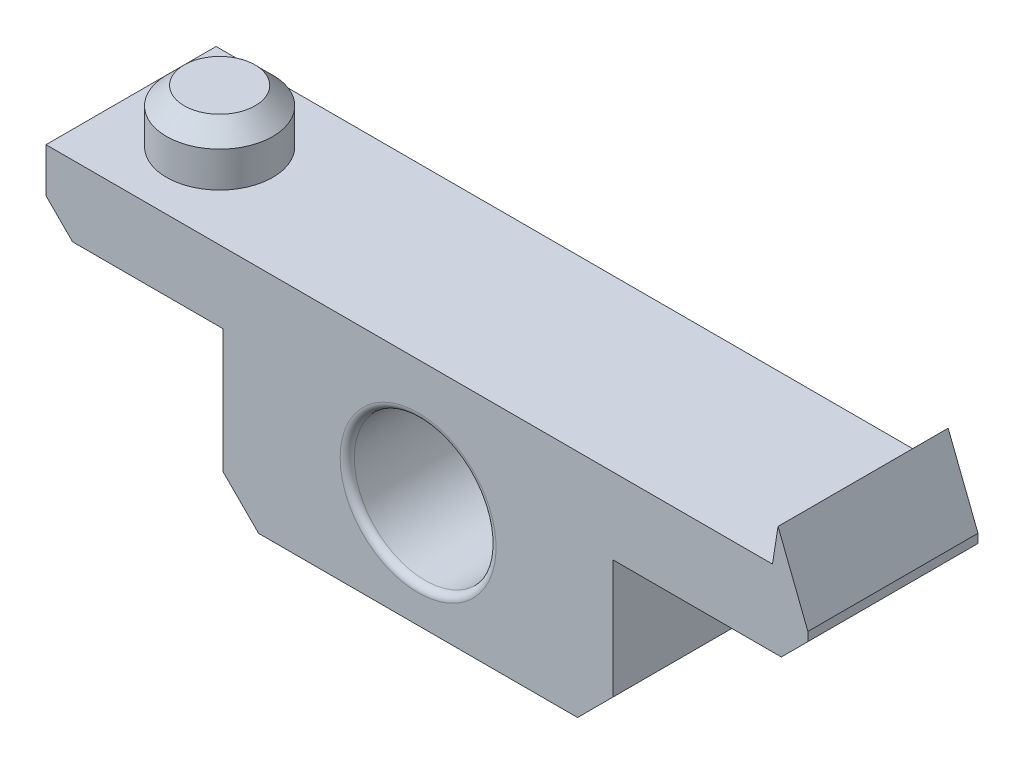
ISO-10303-21;
HEADER;
FILE_DESCRIPTION(('STEP AP214'),'2;1');
FILE_NAME('part.step','',(''),(''),'','','');
FILE_SCHEMA(('AUTOMOTIVE_DESIGN { 1 0 10303 214 1 1 1 1 }'));
ENDSEC;
DATA;
#1=APPLICATION_CONTEXT('core data for automotive mechanical design processes');
#2=APPLICATION_PROTOCOL_DEFINITION('international standard','automotive_design',2000,#1);
#3=PRODUCT_CONTEXT('',#1,'mechanical');
#4=PRODUCT('Part','Part','',(#3));
#5=PRODUCT_RELATED_PRODUCT_CATEGORY('part','',(#4));
#6=PRODUCT_DEFINITION_FORMATION('','',#4);
#7=PRODUCT_DEFINITION_CONTEXT('part definition',#1,'design');
#8=PRODUCT_DEFINITION('design','',#6,#7);
#9=PRODUCT_DEFINITION_SHAPE('','',#8);
#10=(LENGTH_UNIT() NAMED_UNIT(*) SI_UNIT(.MILLI.,.METRE.));
#11=(NAMED_UNIT(*) PLANE_ANGLE_UNIT() SI_UNIT($,.RADIAN.));
#12=(NAMED_UNIT(*) SI_UNIT($,.STERADIAN.) SOLID_ANGLE_UNIT());
#13=UNCERTAINTY_MEASURE_WITH_UNIT(LENGTH_MEASURE(1.E-05),#10,'distance_accuracy_value','');
#14=(GEOMETRIC_REPRESENTATION_CONTEXT(3) GLOBAL_UNCERTAINTY_ASSIGNED_CONTEXT((#13)) GLOBAL_UNIT_ASSIGNED_CONTEXT((#10,
#11,#12)) REPRESENTATION_CONTEXT('',''));
#15=CARTESIAN_POINT('',(0.,0.,0.));
#16=DIRECTION('',(0.,0.,1.));
#17=DIRECTION('',(1.,0.,0.));
#18=AXIS2_PLACEMENT_3D('',#15,#16,#17);
#19=CARTESIAN_POINT('',(0.,-2.,4.8));
#20=DIRECTION('',(1.,0.,0.));
#21=DIRECTION('',(0.,0.,-1.));
#22=AXIS2_PLACEMENT_3D('',#19,#20,#21);
#23=PLANE('',#22);
#24=DIRECTION('',(0.,-1.,0.));
#25=VECTOR('',#24,1.);
#26=CARTESIAN_POINT('',(0.,-2.,0.));
#27=LINE('',#26,#25);
#28=CARTESIAN_POINT('',(0.,0.,0.));
#29=VERTEX_POINT('',#28);
#30=CARTESIAN_POINT('',(0.,-1.24999999999999,0.));
#31=VERTEX_POINT('',#30);
#32=EDGE_CURVE('E182',#29,#31,#27,.T.);
#33=ORIENTED_EDGE('',*,*,#32,.T.);
#34=DIRECTION('',(0.,0.,1.));
#35=VECTOR('',#34,1.);
#36=CARTESIAN_POINT('',(0.,-1.24999999999999,4.8));
#37=LINE('',#36,#35);
#38=CARTESIAN_POINT('',(0.,-1.24999999999999,4.8));
#39=VERTEX_POINT('',#38);
#40=EDGE_CURVE('E238',#31,#39,#37,.T.);
#41=ORIENTED_EDGE('',*,*,#40,.T.);
#42=DIRECTION('',(0.,-1.,0.));
#43=VECTOR('',#42,1.);
#44=CARTESIAN_POINT('',(0.,-2.,4.8));
#45=LINE('',#44,#43);
#46=CARTESIAN_POINT('',(0.,0.,4.8));
#47=VERTEX_POINT('',#46);
#48=EDGE_CURVE('E147',#47,#39,#45,.T.);
#49=ORIENTED_EDGE('',*,*,#48,.F.);
#50=DIRECTION('',(0.,0.,-1.));
#51=VECTOR('',#50,1.);
#52=CARTESIAN_POINT('',(0.,0.,4.8));
#53=LINE('',#52,#51);
#54=EDGE_CURVE('E181',#47,#29,#53,.T.);
#55=ORIENTED_EDGE('',*,*,#54,.T.);
#56=EDGE_LOOP('',(#33,#41,#49,#55));
#57=FACE_BOUND('',#56,.T.);
#58=ADVANCED_FACE('F33',(#57),#23,.F.);
#59=CARTESIAN_POINT('',(5.,-2.,4.8));
#60=DIRECTION('',(0.,1.,0.));
#61=DIRECTION('',(-1.,0.,0.));
#62=AXIS2_PLACEMENT_3D('',#59,#60,#61);
#63=PLANE('',#62);
#64=DIRECTION('',(1.,0.,0.));
#65=VECTOR('',#64,1.);
#66=CARTESIAN_POINT('',(5.,-2.,4.8));
#67=LINE('',#66,#65);
#68=CARTESIAN_POINT('',(0.750000000000004,-2.,4.8));
#69=VERTEX_POINT('',#68);
#70=CARTESIAN_POINT('',(5.,-2.,4.8));
#71=VERTEX_POINT('',#70);
#72=EDGE_CURVE('E135',#69,#71,#67,.T.);
#73=ORIENTED_EDGE('',*,*,#72,.F.);
#74=DIRECTION('',(0.,0.,-1.));
#75=VECTOR('',#74,1.);
#76=CARTESIAN_POINT('',(0.750000000000004,-2.,4.8));
#77=LINE('',#76,#75);
#78=CARTESIAN_POINT('',(0.750000000000004,-2.,0.));
#79=VERTEX_POINT('',#78);
#80=EDGE_CURVE('E232',#69,#79,#77,.T.);
#81=ORIENTED_EDGE('',*,*,#80,.T.);
#82=DIRECTION('',(1.,0.,0.));
#83=VECTOR('',#82,1.);
#84=CARTESIAN_POINT('',(5.,-2.,0.));
#85=LINE('',#84,#83);
#86=CARTESIAN_POINT('',(5.,-2.,0.));
#87=VERTEX_POINT('',#86);
#88=EDGE_CURVE('E153',#79,#87,#85,.T.);
#89=ORIENTED_EDGE('',*,*,#88,.T.);
#90=DIRECTION('',(0.,0.,-1.));
#91=VECTOR('',#90,1.);
#92=CARTESIAN_POINT('',(5.,-2.,4.8));
#93=LINE('',#92,#91);
#94=EDGE_CURVE('E150',#71,#87,#93,.T.);
#95=ORIENTED_EDGE('',*,*,#94,.F.);
#96=EDGE_LOOP('',(#73,#81,#89,#95));
#97=FACE_BOUND('',#96,.T.);
#98=ADVANCED_FACE('F151',(#97),#63,.F.);
#99=CARTESIAN_POINT('',(5.,-6.5,4.8));
#100=DIRECTION('',(1.,0.,0.));
#101=DIRECTION('',(0.,0.,-1.));
#102=AXIS2_PLACEMENT_3D('',#99,#100,#101);
#103=PLANE('',#102);
#104=DIRECTION('',(0.,-1.,0.));
#105=VECTOR('',#104,1.);
#106=CARTESIAN_POINT('',(5.,-6.5,0.));
#107=LINE('',#106,#105);
#108=CARTESIAN_POINT('',(5.,-5.49999999999999,0.));
#109=VERTEX_POINT('',#108);
#110=EDGE_CURVE('E186',#87,#109,#107,.T.);
#111=ORIENTED_EDGE('',*,*,#110,.T.);
#112=DIRECTION('',(0.,0.,1.));
#113=VECTOR('',#112,1.);
#114=CARTESIAN_POINT('',(5.,-5.49999999999999,4.8));
#115=LINE('',#114,#113);
#116=CARTESIAN_POINT('',(5.,-5.49999999999999,4.8));
#117=VERTEX_POINT('',#116);
#118=EDGE_CURVE('E162',#109,#117,#115,.T.);
#119=ORIENTED_EDGE('',*,*,#118,.T.);
#120=DIRECTION('',(0.,-1.,0.));
#121=VECTOR('',#120,1.);
#122=CARTESIAN_POINT('',(5.,-6.5,4.8));
#123=LINE('',#122,#121);
#124=EDGE_CURVE('E140',#71,#117,#123,.T.);
#125=ORIENTED_EDGE('',*,*,#124,.F.);
#126=ORIENTED_EDGE('',*,*,#94,.T.);
#127=EDGE_LOOP('',(#111,#119,#125,#126));
#128=FACE_BOUND('',#127,.T.);
#129=ADVANCED_FACE('F160',(#128),#103,.F.);
#130=CARTESIAN_POINT('',(16.,-6.5,4.8));
#131=DIRECTION('',(0.,1.,0.));
#132=DIRECTION('',(-1.,0.,0.));
#133=AXIS2_PLACEMENT_3D('',#130,#131,#132);
#134=PLANE('',#133);
#135=DIRECTION('',(1.,0.,0.));
#136=VECTOR('',#135,1.);
#137=CARTESIAN_POINT('',(16.,-6.5,0.));
#138=LINE('',#137,#136);
#139=CARTESIAN_POINT('',(5.99999999999999,-6.5,0.));
#140=VERTEX_POINT('',#139);
#141=CARTESIAN_POINT('',(15.,-6.5,0.));
#142=VERTEX_POINT('',#141);
#143=EDGE_CURVE('E188',#140,#142,#138,.T.);
#144=ORIENTED_EDGE('',*,*,#143,.T.);
#145=DIRECTION('',(0.,0.,1.));
#146=VECTOR('',#145,1.);
#147=CARTESIAN_POINT('',(15.,-6.5,4.8));
#148=LINE('',#147,#146);
#149=CARTESIAN_POINT('',(15.,-6.5,4.8));
#150=VERTEX_POINT('',#149);
#151=EDGE_CURVE('E225',#142,#150,#148,.T.);
#152=ORIENTED_EDGE('',*,*,#151,.T.);
#153=DIRECTION('',(1.,0.,0.));
#154=VECTOR('',#153,1.);
#155=CARTESIAN_POINT('',(16.,-6.5,4.8));
#156=LINE('',#155,#154);
#157=CARTESIAN_POINT('',(6.,-6.5,4.8));
#158=VERTEX_POINT('',#157);
#159=EDGE_CURVE('E163',#158,#150,#156,.T.);
#160=ORIENTED_EDGE('',*,*,#159,.F.);
#161=DIRECTION('',(0.,0.,-1.));
#162=VECTOR('',#161,1.);
#163=CARTESIAN_POINT('',(6.,-6.5,4.8));
#164=LINE('',#163,#162);
#165=EDGE_CURVE('E222',#158,#140,#164,.T.);
#166=ORIENTED_EDGE('',*,*,#165,.T.);
#167=EDGE_LOOP('',(#144,#152,#160,#166));
#168=FACE_BOUND('',#167,.T.);
#169=ADVANCED_FACE('F362',(#168),#134,.F.);
#170=CARTESIAN_POINT('',(16.,-2.14610721246322,4.8));
#171=DIRECTION('',(-1.,0.,0.));
#172=DIRECTION('',(0.,0.,1.));
#173=AXIS2_PLACEMENT_3D('',#170,#171,#172);
#174=PLANE('',#173);
#175=DIRECTION('',(0.,1.,0.));
#176=VECTOR('',#175,1.);
#177=CARTESIAN_POINT('',(16.,-2.14610721246322,4.8));
#178=LINE('',#177,#176);
#179=CARTESIAN_POINT('',(16.,-5.5,4.8));
#180=VERTEX_POINT('',#179);
#181=CARTESIAN_POINT('',(16.,-2.14610721246322,4.8));
#182=VERTEX_POINT('',#181);
#183=EDGE_CURVE('E166',#180,#182,#178,.T.);
#184=ORIENTED_EDGE('',*,*,#183,.F.);
#185=DIRECTION('',(0.,0.,-1.));
#186=VECTOR('',#185,1.);
#187=CARTESIAN_POINT('',(16.,-5.5,4.8));
#188=LINE('',#187,#186);
#189=CARTESIAN_POINT('',(16.,-5.5,0.));
#190=VERTEX_POINT('',#189);
#191=EDGE_CURVE('E157',#180,#190,#188,.T.);
#192=ORIENTED_EDGE('',*,*,#191,.T.);
#193=DIRECTION('',(0.,1.,0.));
#194=VECTOR('',#193,1.);
#195=CARTESIAN_POINT('',(16.,-2.14610721246322,0.));
#196=LINE('',#195,#194);
#197=CARTESIAN_POINT('',(16.,-2.14610721246322,0.));
#198=VERTEX_POINT('',#197);
#199=EDGE_CURVE('E191',#190,#198,#196,.T.);
#200=ORIENTED_EDGE('',*,*,#199,.T.);
#201=DIRECTION('',(0.,0.,-1.));
#202=VECTOR('',#201,1.);
#203=CARTESIAN_POINT('',(16.,-2.14610721246322,4.8));
#204=LINE('',#203,#202);
#205=EDGE_CURVE('E158',#182,#198,#204,.T.);
#206=ORIENTED_EDGE('',*,*,#205,.F.);
#207=EDGE_LOOP('',(#184,#192,#200,#206));
#208=FACE_BOUND('',#207,.T.);
#209=ADVANCED_FACE('F357',(#208),#174,.F.);
#210=CARTESIAN_POINT('',(21.5,-2.14610721246322,4.8));
#211=DIRECTION('',(0.,1.,0.));
#212=DIRECTION('',(-1.,0.,0.));
#213=AXIS2_PLACEMENT_3D('',#210,#211,#212);
#214=PLANE('',#213);
#215=DIRECTION('',(1.,0.,0.));
#216=VECTOR('',#215,1.);
#217=CARTESIAN_POINT('',(21.5,-2.14610721246322,0.));
#218=LINE('',#217,#216);
#219=CARTESIAN_POINT('',(20.75,-2.14610721246322,0.));
#220=VERTEX_POINT('',#219);
#221=EDGE_CURVE('E193',#198,#220,#218,.T.);
#222=ORIENTED_EDGE('',*,*,#221,.T.);
#223=DIRECTION('',(0.,0.,1.));
#224=VECTOR('',#223,1.);
#225=CARTESIAN_POINT('',(20.75,-2.14610721246322,4.8));
#226=LINE('',#225,#224);
#227=CARTESIAN_POINT('',(20.75,-2.14610721246322,4.8));
#228=VERTEX_POINT('',#227);
#229=EDGE_CURVE('E56',#220,#228,#226,.T.);
#230=ORIENTED_EDGE('',*,*,#229,.T.);
#231=DIRECTION('',(1.,0.,0.));
#232=VECTOR('',#231,1.);
#233=CARTESIAN_POINT('',(21.5,-2.14610721246322,4.8));
#234=LINE('',#233,#232);
#235=EDGE_CURVE('E171',#182,#228,#234,.T.);
#236=ORIENTED_EDGE('',*,*,#235,.F.);
#237=ORIENTED_EDGE('',*,*,#205,.T.);
#238=EDGE_LOOP('',(#222,#230,#236,#237));
#239=FACE_BOUND('',#238,.T.);
#240=ADVANCED_FACE('F353',(#239),#214,.F.);
#241=CARTESIAN_POINT('',(21.5,-1.14610721246322,4.8));
#242=DIRECTION('',(-1.,0.,0.));
#243=DIRECTION('',(0.,0.,1.));
#244=AXIS2_PLACEMENT_3D('',#241,#242,#243);
#245=PLANE('',#244);
#246=DIRECTION('',(0.,1.,0.));
#247=VECTOR('',#246,1.);
#248=CARTESIAN_POINT('',(21.5,-1.14610721246322,4.8));
#249=LINE('',#248,#247);
#250=CARTESIAN_POINT('',(21.5,-1.39610721246322,4.8));
#251=VERTEX_POINT('',#250);
#252=CARTESIAN_POINT('',(21.5,-1.14610721246322,4.8));
#253=VERTEX_POINT('',#252);
#254=EDGE_CURVE('E173',#251,#253,#249,.T.);
#255=ORIENTED_EDGE('',*,*,#254,.F.);
#256=DIRECTION('',(0.,0.,-1.));
#257=VECTOR('',#256,1.);
#258=CARTESIAN_POINT('',(21.5,-1.39610721246322,4.8));
#259=LINE('',#258,#257);
#260=CARTESIAN_POINT('',(21.5,-1.39610721246322,0.));
#261=VERTEX_POINT('',#260);
#262=EDGE_CURVE('E242',#251,#261,#259,.T.);
#263=ORIENTED_EDGE('',*,*,#262,.T.);
#264=DIRECTION('',(0.,1.,0.));
#265=VECTOR('',#264,1.);
#266=CARTESIAN_POINT('',(21.5,-1.14610721246322,0.));
#267=LINE('',#266,#265);
#268=CARTESIAN_POINT('',(21.5,-1.14610721246322,0.));
#269=VERTEX_POINT('',#268);
#270=EDGE_CURVE('E195',#261,#269,#267,.T.);
#271=ORIENTED_EDGE('',*,*,#270,.T.);
#272=DIRECTION('',(0.,0.,-1.));
#273=VECTOR('',#272,1.);
#274=CARTESIAN_POINT('',(21.5,-1.14610721246322,4.8));
#275=LINE('',#274,#273);
#276=EDGE_CURVE('E211',#253,#269,#275,.T.);
#277=ORIENTED_EDGE('',*,*,#276,.F.);
#278=EDGE_LOOP('',(#255,#263,#271,#277));
#279=FACE_BOUND('',#278,.T.);
#280=ADVANCED_FACE('F349',(#279),#245,.F.);
#281=CARTESIAN_POINT('',(20.6573267874174,1.,4.8));
#282=DIRECTION('',(-0.930816476461079,-0.365486917889794,0.));
#283=DIRECTION('',(0.365486917889794,-0.930816476461079,0.));
#284=AXIS2_PLACEMENT_3D('',#281,#282,#283);
#285=PLANE('',#284);
#286=DIRECTION('',(-0.365486917889794,0.930816476461079,0.));
#287=VECTOR('',#286,1.);
#288=CARTESIAN_POINT('',(20.6573267874174,1.,0.));
#289=LINE('',#288,#287);
#290=CARTESIAN_POINT('',(20.6573267874174,1.,0.));
#291=VERTEX_POINT('',#290);
#292=EDGE_CURVE('E197',#269,#291,#289,.T.);
#293=ORIENTED_EDGE('',*,*,#292,.T.);
#294=DIRECTION('',(0.,0.,-1.));
#295=VECTOR('',#294,1.);
#296=CARTESIAN_POINT('',(20.6573267874174,1.,4.8));
#297=LINE('',#296,#295);
#298=CARTESIAN_POINT('',(20.6573267874174,1.,4.8));
#299=VERTEX_POINT('',#298);
#300=EDGE_CURVE('E208',#299,#291,#297,.T.);
#301=ORIENTED_EDGE('',*,*,#300,.F.);
#302=DIRECTION('',(-0.365486917889794,0.930816476461079,0.));
#303=VECTOR('',#302,1.);
#304=CARTESIAN_POINT('',(20.6573267874174,1.,4.8));
#305=LINE('',#304,#303);
#306=EDGE_CURVE('E175',#253,#299,#305,.T.);
#307=ORIENTED_EDGE('',*,*,#306,.F.);
#308=ORIENTED_EDGE('',*,*,#276,.T.);
#309=EDGE_LOOP('',(#293,#301,#307,#308));
#310=FACE_BOUND('',#309,.T.);
#311=ADVANCED_FACE('F346',(#310),#285,.F.);
#312=CARTESIAN_POINT('',(20.5,0.,4.8));
#313=DIRECTION('',(0.987849245431031,-0.155415148236402,0.));
#314=DIRECTION('',(0.155415148236402,0.987849245431031,0.));
#315=AXIS2_PLACEMENT_3D('',#312,#313,#314);
#316=PLANE('',#315);
#317=DIRECTION('',(-0.155415148236402,-0.987849245431031,0.));
#318=VECTOR('',#317,1.);
#319=CARTESIAN_POINT('',(20.5,0.,0.));
#320=LINE('',#319,#318);
#321=CARTESIAN_POINT('',(20.5,0.,0.));
#322=VERTEX_POINT('',#321);
#323=EDGE_CURVE('E199',#291,#322,#320,.T.);
#324=ORIENTED_EDGE('',*,*,#323,.T.);
#325=DIRECTION('',(0.,0.,-1.));
#326=VECTOR('',#325,1.);
#327=CARTESIAN_POINT('',(20.5,0.,4.8));
#328=LINE('',#327,#326);
#329=CARTESIAN_POINT('',(20.5,0.,4.8));
#330=VERTEX_POINT('',#329);
#331=EDGE_CURVE('E205',#330,#322,#328,.T.);
#332=ORIENTED_EDGE('',*,*,#331,.F.);
#333=DIRECTION('',(-0.155415148236402,-0.987849245431031,0.));
#334=VECTOR('',#333,1.);
#335=CARTESIAN_POINT('',(20.5,0.,4.8));
#336=LINE('',#335,#334);
#337=EDGE_CURVE('E177',#299,#330,#336,.T.);
#338=ORIENTED_EDGE('',*,*,#337,.F.);
#339=ORIENTED_EDGE('',*,*,#300,.T.);
#340=EDGE_LOOP('',(#324,#332,#338,#339));
#341=FACE_BOUND('',#340,.T.);
#342=ADVANCED_FACE('F329',(#341),#316,.F.);
#343=CARTESIAN_POINT('',(0.,0.,4.8));
#344=DIRECTION('',(0.,-1.,0.));
#345=DIRECTION('',(0.,0.,-1.));
#346=AXIS2_PLACEMENT_3D('',#343,#344,#345);
#347=PLANE('',#346);
#348=CARTESIAN_POINT('',(2.5,0.,2.4));
#349=DIRECTION('',(0.,-1.,0.));
#350=DIRECTION('',(0.,0.,-1.));
#351=AXIS2_PLACEMENT_3D('',#348,#349,#350);
#352=CIRCLE('',#351,1.5);
#353=CARTESIAN_POINT('',(2.5,0.,0.9));
#354=VERTEX_POINT('',#353);
#355=EDGE_CURVE('E246',#354,#354,#352,.F.);
#356=ORIENTED_EDGE('',*,*,#355,.F.);
#357=EDGE_LOOP('',(#356));
#358=FACE_BOUND('',#357,.T.);
#359=DIRECTION('',(-1.,0.,0.));
#360=VECTOR('',#359,1.);
#361=CARTESIAN_POINT('',(0.,0.,0.));
#362=LINE('',#361,#360);
#363=EDGE_CURVE('E201',#322,#29,#362,.T.);
#364=ORIENTED_EDGE('',*,*,#363,.T.);
#365=ORIENTED_EDGE('',*,*,#54,.F.);
#366=DIRECTION('',(-1.,0.,0.));
#367=VECTOR('',#366,1.);
#368=CARTESIAN_POINT('',(0.,0.,4.8));
#369=LINE('',#368,#367);
#370=EDGE_CURVE('E179',#330,#47,#369,.T.);
#371=ORIENTED_EDGE('',*,*,#370,.F.);
#372=ORIENTED_EDGE('',*,*,#331,.T.);
#373=EDGE_LOOP('',(#364,#365,#371,#372));
#374=FACE_BOUND('',#373,.T.);
#375=ADVANCED_FACE('F326',(#358,#374),#347,.F.);
#376=CARTESIAN_POINT('',(0.,0.,4.8));
#377=DIRECTION('',(0.,0.,-1.));
#378=DIRECTION('',(-1.,0.,0.));
#379=AXIS2_PLACEMENT_3D('',#376,#377,#378);
#380=PLANE('',#379);
#381=CARTESIAN_POINT('',(10.5,-3.5,4.8));
#382=DIRECTION('',(0.,0.,-1.));
#383=DIRECTION('',(-1.,0.,0.));
#384=AXIS2_PLACEMENT_3D('',#381,#382,#383);
#385=CIRCLE('',#384,2.2);
#386=CARTESIAN_POINT('',(8.3,-3.5,4.8));
#387=VERTEX_POINT('',#386);
#388=EDGE_CURVE('E11',#387,#387,#385,.T.);
#389=ORIENTED_EDGE('',*,*,#388,.T.);
#390=EDGE_LOOP('',(#389));
#391=FACE_BOUND('',#390,.T.);
#392=ORIENTED_EDGE('',*,*,#48,.T.);
#393=DIRECTION('',(-0.707106781186544,0.707106781186551,0.));
#394=VECTOR('',#393,1.);
#395=CARTESIAN_POINT('',(0.750000000000004,-2.,4.8));
#396=LINE('',#395,#394);
#397=EDGE_CURVE('E143',#39,#69,#396,.F.);
#398=ORIENTED_EDGE('',*,*,#397,.T.);
#399=ORIENTED_EDGE('',*,*,#72,.T.);
#400=ORIENTED_EDGE('',*,*,#124,.T.);
#401=DIRECTION('',(-0.707106781186545,0.70710678118655,0.));
#402=VECTOR('',#401,1.);
#403=CARTESIAN_POINT('',(6.,-6.5,4.8));
#404=LINE('',#403,#402);
#405=EDGE_CURVE('E227',#117,#158,#404,.F.);
#406=ORIENTED_EDGE('',*,*,#405,.T.);
#407=ORIENTED_EDGE('',*,*,#159,.T.);
#408=DIRECTION('',(-0.70710678118655,-0.707106781186545,0.));
#409=VECTOR('',#408,1.);
#410=CARTESIAN_POINT('',(16.,-5.5,4.8));
#411=LINE('',#410,#409);
#412=EDGE_CURVE('E229',#150,#180,#411,.F.);
#413=ORIENTED_EDGE('',*,*,#412,.T.);
#414=ORIENTED_EDGE('',*,*,#183,.T.);
#415=ORIENTED_EDGE('',*,*,#235,.T.);
#416=DIRECTION('',(-0.707106781186549,-0.707106781186546,0.));
#417=VECTOR('',#416,1.);
#418=CARTESIAN_POINT('',(21.5,-1.39610721246322,4.8));
#419=LINE('',#418,#417);
#420=EDGE_CURVE('E48',#228,#251,#419,.F.);
#421=ORIENTED_EDGE('',*,*,#420,.T.);
#422=ORIENTED_EDGE('',*,*,#254,.T.);
#423=ORIENTED_EDGE('',*,*,#306,.T.);
#424=ORIENTED_EDGE('',*,*,#337,.T.);
#425=ORIENTED_EDGE('',*,*,#370,.T.);
#426=EDGE_LOOP('',(#392,#398,#399,#400,#406,#407,#413,#414,#415,#421,#422,#423,#424,#425));
#427=FACE_BOUND('',#426,.T.);
#428=ADVANCED_FACE('F138',(#391,#427),#380,.F.);
#429=CARTESIAN_POINT('',(0.,0.,0.));
#430=DIRECTION('',(0.,0.,-1.));
#431=DIRECTION('',(-1.,0.,0.));
#432=AXIS2_PLACEMENT_3D('',#429,#430,#431);
#433=PLANE('',#432);
#434=CARTESIAN_POINT('',(10.5,-3.5,0.));
#435=DIRECTION('',(0.,0.,-1.));
#436=DIRECTION('',(-1.,0.,0.));
#437=AXIS2_PLACEMENT_3D('',#434,#435,#436);
#438=CIRCLE('',#437,2.2);
#439=CARTESIAN_POINT('',(8.3,-3.5,0.));
#440=VERTEX_POINT('',#439);
#441=EDGE_CURVE('E41',#440,#440,#438,.F.);
#442=ORIENTED_EDGE('',*,*,#441,.T.);
#443=EDGE_LOOP('',(#442));
#444=FACE_BOUND('',#443,.T.);
#445=ORIENTED_EDGE('',*,*,#88,.F.);
#446=DIRECTION('',(0.707106781186544,-0.707106781186551,0.));
#447=VECTOR('',#446,1.);
#448=CARTESIAN_POINT('',(-0.624999999999994,-0.624999999999989,0.));
#449=LINE('',#448,#447);
#450=EDGE_CURVE('E236',#79,#31,#449,.F.);
#451=ORIENTED_EDGE('',*,*,#450,.T.);
#452=ORIENTED_EDGE('',*,*,#32,.F.);
#453=ORIENTED_EDGE('',*,*,#363,.F.);
#454=ORIENTED_EDGE('',*,*,#323,.F.);
#455=ORIENTED_EDGE('',*,*,#292,.F.);
#456=ORIENTED_EDGE('',*,*,#270,.F.);
#457=DIRECTION('',(0.707106781186549,0.707106781186546,0.));
#458=VECTOR('',#457,1.);
#459=CARTESIAN_POINT('',(11.4480536062316,-11.4480536062316,0.));
#460=LINE('',#459,#458);
#461=EDGE_CURVE('E234',#261,#220,#460,.F.);
#462=ORIENTED_EDGE('',*,*,#461,.T.);
#463=ORIENTED_EDGE('',*,*,#221,.F.);
#464=ORIENTED_EDGE('',*,*,#199,.F.);
#465=DIRECTION('',(0.70710678118655,0.707106781186545,0.));
#466=VECTOR('',#465,1.);
#467=CARTESIAN_POINT('',(10.7499999999999,-10.75,0.));
#468=LINE('',#467,#466);
#469=EDGE_CURVE('E220',#190,#142,#468,.F.);
#470=ORIENTED_EDGE('',*,*,#469,.T.);
#471=ORIENTED_EDGE('',*,*,#143,.F.);
#472=DIRECTION('',(0.707106781186545,-0.70710678118655,0.));
#473=VECTOR('',#472,1.);
#474=CARTESIAN_POINT('',(-0.249999999999981,-0.24999999999998,0.));
#475=LINE('',#474,#473);
#476=EDGE_CURVE('E218',#140,#109,#475,.F.);
#477=ORIENTED_EDGE('',*,*,#476,.T.);
#478=ORIENTED_EDGE('',*,*,#110,.F.);
#479=EDGE_LOOP('',(#445,#451,#452,#453,#454,#455,#456,#462,#463,#464,#470,#471,#477,#478));
#480=FACE_BOUND('',#479,.T.);
#481=ADVANCED_FACE('F263',(#444,#480),#433,.T.);
#482=CARTESIAN_POINT('',(10.5,-3.5,-5.2));
#483=DIRECTION('',(0.,0.,1.));
#484=DIRECTION('',(1.,0.,0.));
#485=AXIS2_PLACEMENT_3D('',#482,#483,#484);
#486=CYLINDRICAL_SURFACE('',#485,2.);
#487=CARTESIAN_POINT('',(10.5,-3.5,0.2));
#488=DIRECTION('',(0.,0.,-1.));
#489=DIRECTION('',(-1.,0.,0.));
#490=AXIS2_PLACEMENT_3D('',#487,#488,#489);
#491=CIRCLE('',#490,2.);
#492=CARTESIAN_POINT('',(8.5,-3.5,0.2));
#493=VERTEX_POINT('',#492);
#494=EDGE_CURVE('E258',#493,#493,#491,.T.);
#495=ORIENTED_EDGE('',*,*,#494,.T.);
#496=EDGE_LOOP('',(#495));
#497=FACE_BOUND('',#496,.T.);
#498=CARTESIAN_POINT('',(10.5,-3.5,4.6));
#499=DIRECTION('',(0.,0.,-1.));
#500=DIRECTION('',(-1.,0.,0.));
#501=AXIS2_PLACEMENT_3D('',#498,#499,#500);
#502=CIRCLE('',#501,2.);
#503=CARTESIAN_POINT('',(8.5,-3.5,4.6));
#504=VERTEX_POINT('',#503);
#505=EDGE_CURVE('E255',#504,#504,#502,.F.);
#506=ORIENTED_EDGE('',*,*,#505,.T.);
#507=EDGE_LOOP('',(#506));
#508=FACE_BOUND('',#507,.T.);
#509=ADVANCED_FACE('F272',(#497,#508),#486,.F.);
#510=CARTESIAN_POINT('',(16.,-5.5,4.8));
#511=DIRECTION('',(-0.707106781186545,0.70710678118655,0.));
#512=DIRECTION('',(0.,0.,-1.));
#513=AXIS2_PLACEMENT_3D('',#510,#511,#512);
#514=PLANE('',#513);
#515=ORIENTED_EDGE('',*,*,#412,.F.);
#516=ORIENTED_EDGE('',*,*,#151,.F.);
#517=ORIENTED_EDGE('',*,*,#469,.F.);
#518=ORIENTED_EDGE('',*,*,#191,.F.);
#519=EDGE_LOOP('',(#515,#516,#517,#518));
#520=FACE_BOUND('',#519,.T.);
#521=ADVANCED_FACE('F275',(#520),#514,.F.);
#522=CARTESIAN_POINT('',(6.,-6.5,4.8));
#523=DIRECTION('',(0.70710678118655,0.707106781186545,0.));
#524=DIRECTION('',(0.,0.,-1.));
#525=AXIS2_PLACEMENT_3D('',#522,#523,#524);
#526=PLANE('',#525);
#527=ORIENTED_EDGE('',*,*,#405,.F.);
#528=ORIENTED_EDGE('',*,*,#118,.F.);
#529=ORIENTED_EDGE('',*,*,#476,.F.);
#530=ORIENTED_EDGE('',*,*,#165,.F.);
#531=EDGE_LOOP('',(#527,#528,#529,#530));
#532=FACE_BOUND('',#531,.T.);
#533=ADVANCED_FACE('F295',(#532),#526,.F.);
#534=CARTESIAN_POINT('',(0.750000000000004,-2.,4.8));
#535=DIRECTION('',(0.707106781186551,0.707106781186544,0.));
#536=DIRECTION('',(0.,0.,-1.));
#537=AXIS2_PLACEMENT_3D('',#534,#535,#536);
#538=PLANE('',#537);
#539=ORIENTED_EDGE('',*,*,#397,.F.);
#540=ORIENTED_EDGE('',*,*,#40,.F.);
#541=ORIENTED_EDGE('',*,*,#450,.F.);
#542=ORIENTED_EDGE('',*,*,#80,.F.);
#543=EDGE_LOOP('',(#539,#540,#541,#542));
#544=FACE_BOUND('',#543,.T.);
#545=ADVANCED_FACE('F299',(#544),#538,.F.);
#546=CARTESIAN_POINT('',(21.5,-1.39610721246322,4.8));
#547=DIRECTION('',(-0.707106781186546,0.707106781186549,0.));
#548=DIRECTION('',(0.,0.,-1.));
#549=AXIS2_PLACEMENT_3D('',#546,#547,#548);
#550=PLANE('',#549);
#551=ORIENTED_EDGE('',*,*,#420,.F.);
#552=ORIENTED_EDGE('',*,*,#229,.F.);
#553=ORIENTED_EDGE('',*,*,#461,.F.);
#554=ORIENTED_EDGE('',*,*,#262,.F.);
#555=EDGE_LOOP('',(#551,#552,#553,#554));
#556=FACE_BOUND('',#555,.T.);
#557=ADVANCED_FACE('F303',(#556),#550,.F.);
#558=CARTESIAN_POINT('',(2.5,1.5,2.4));
#559=DIRECTION('',(0.,-1.,0.));
#560=DIRECTION('',(0.,0.,-1.));
#561=AXIS2_PLACEMENT_3D('',#558,#559,#560);
#562=CYLINDRICAL_SURFACE('',#561,1.5);
#563=CARTESIAN_POINT('',(2.5,0.999999999999999,2.4));
#564=DIRECTION('',(0.,1.,0.));
#565=DIRECTION('',(0.,0.,1.));
#566=AXIS2_PLACEMENT_3D('',#563,#564,#565);
#567=CIRCLE('',#566,1.5);
#568=CARTESIAN_POINT('',(2.5,0.999999999999999,3.9));
#569=VERTEX_POINT('',#568);
#570=EDGE_CURVE('E252',#569,#569,#567,.F.);
#571=ORIENTED_EDGE('',*,*,#570,.T.);
#572=EDGE_LOOP('',(#571));
#573=FACE_BOUND('',#572,.T.);
#574=ORIENTED_EDGE('',*,*,#355,.T.);
#575=EDGE_LOOP('',(#574));
#576=FACE_BOUND('',#575,.T.);
#577=ADVANCED_FACE('F307',(#573,#576),#562,.T.);
#578=CARTESIAN_POINT('',(2.5,1.5,2.4));
#579=DIRECTION('',(0.,1.,0.));
#580=DIRECTION('',(0.,0.,1.));
#581=AXIS2_PLACEMENT_3D('',#578,#579,#580);
#582=PLANE('',#581);
#583=CARTESIAN_POINT('',(2.5,1.5,2.4));
#584=DIRECTION('',(0.,1.,0.));
#585=DIRECTION('',(0.,0.,1.));
#586=AXIS2_PLACEMENT_3D('',#583,#584,#585);
#587=CIRCLE('',#586,1.);
#588=CARTESIAN_POINT('',(2.5,1.5,3.4));
#589=VERTEX_POINT('',#588);
#590=EDGE_CURVE('E249',#589,#589,#587,.T.);
#591=ORIENTED_EDGE('',*,*,#590,.T.);
#592=EDGE_LOOP('',(#591));
#593=FACE_BOUND('',#592,.T.);
#594=ADVANCED_FACE('F310',(#593),#582,.T.);
#595=CARTESIAN_POINT('',(2.5,1.5,2.4));
#596=DIRECTION('',(0.,-1.,0.));
#597=DIRECTION('',(0.,0.,-1.));
#598=AXIS2_PLACEMENT_3D('',#595,#596,#597);
#599=CONICAL_SURFACE('',#598,1.,0.785398163397447);
#600=ORIENTED_EDGE('',*,*,#570,.F.);
#601=EDGE_LOOP('',(#600));
#602=FACE_BOUND('',#601,.T.);
#603=ORIENTED_EDGE('',*,*,#590,.F.);
#604=EDGE_LOOP('',(#603));
#605=FACE_BOUND('',#604,.T.);
#606=ADVANCED_FACE('F269',(#602,#605),#599,.T.);
#607=CARTESIAN_POINT('',(10.5,-3.5,0.2));
#608=DIRECTION('',(0.,0.,-1.));
#609=DIRECTION('',(-1.,0.,0.));
#610=AXIS2_PLACEMENT_3D('',#607,#608,#609);
#611=TOROIDAL_SURFACE('',#610,2.2,0.2);
#612=ORIENTED_EDGE('',*,*,#441,.F.);
#613=EDGE_LOOP('',(#612));
#614=FACE_BOUND('',#613,.T.);
#615=ORIENTED_EDGE('',*,*,#494,.F.);
#616=EDGE_LOOP('',(#615));
#617=FACE_BOUND('',#616,.T.);
#618=ADVANCED_FACE('F266',(#614,#617),#611,.T.);
#619=CARTESIAN_POINT('',(10.5,-3.5,4.6));
#620=DIRECTION('',(0.,0.,-1.));
#621=DIRECTION('',(-1.,0.,0.));
#622=AXIS2_PLACEMENT_3D('',#619,#620,#621);
#623=TOROIDAL_SURFACE('',#622,2.2,0.2);
#624=ORIENTED_EDGE('',*,*,#388,.F.);
#625=EDGE_LOOP('',(#624));
#626=FACE_BOUND('',#625,.T.);
#627=ORIENTED_EDGE('',*,*,#505,.F.);
#628=EDGE_LOOP('',(#627));
#629=FACE_BOUND('',#628,.T.);
#630=ADVANCED_FACE('F35',(#626,#629),#623,.T.);
#631=CLOSED_SHELL('',(#58,#98,#129,#169,#209,#240,#280,#311,#342,#375,#428,#481,#509,#521,#533,
#545,#557,#577,#594,#606,#618,#630));
#632=MANIFOLD_SOLID_BREP('B2',#631);
#633=ADVANCED_BREP_SHAPE_REPRESENTATION('',(#18,#632),#14);
#634=SHAPE_DEFINITION_REPRESENTATION(#9,#633);
ENDSEC;
END-ISO-10303-21;
